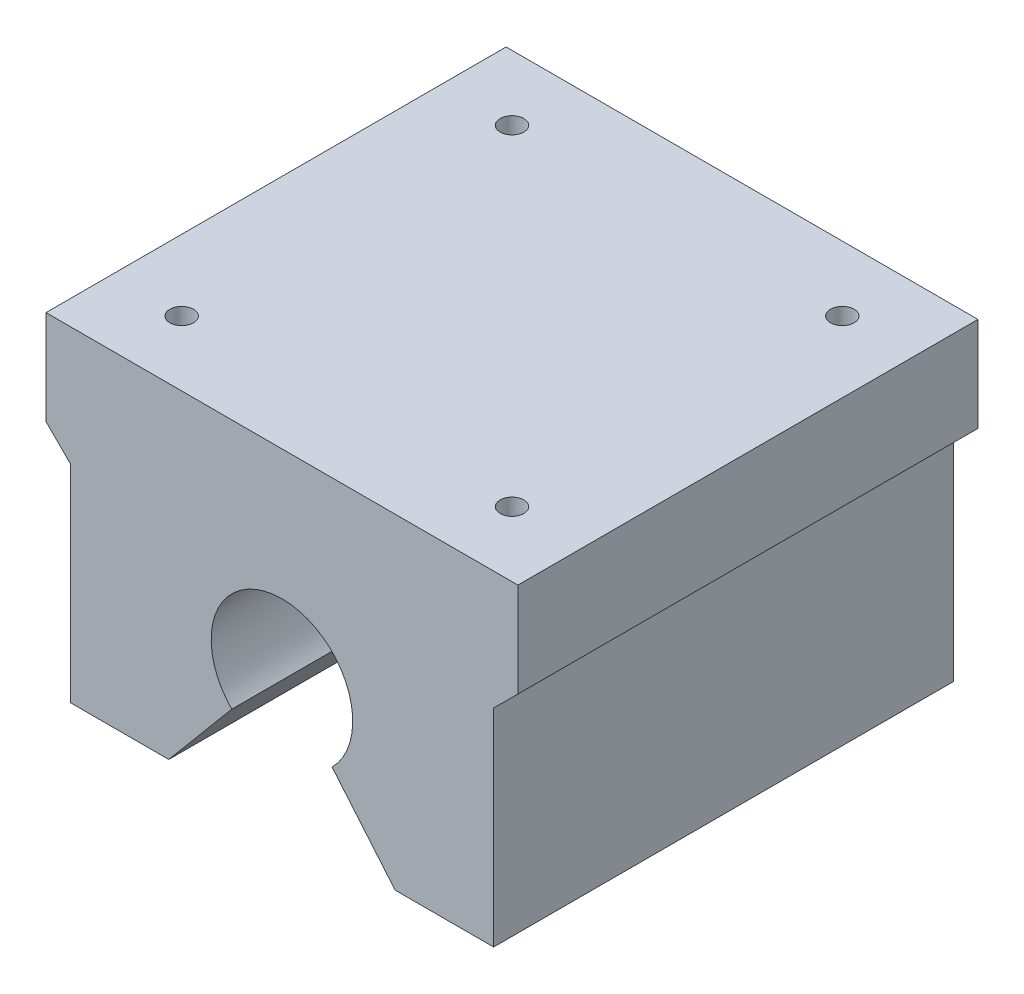
ISO-10303-21;
HEADER;
FILE_DESCRIPTION(('STEP AP214'),'2;1');
FILE_NAME('part.step','',(''),(''),'','','');
FILE_SCHEMA(('AUTOMOTIVE_DESIGN { 1 0 10303 214 1 1 1 1 }'));
ENDSEC;
DATA;
#1=APPLICATION_CONTEXT('core data for automotive mechanical design processes');
#2=APPLICATION_PROTOCOL_DEFINITION('international standard','automotive_design',2000,#1);
#3=PRODUCT_CONTEXT('',#1,'mechanical');
#4=PRODUCT('Part','Part','',(#3));
#5=PRODUCT_RELATED_PRODUCT_CATEGORY('part','',(#4));
#6=PRODUCT_DEFINITION_FORMATION('','',#4);
#7=PRODUCT_DEFINITION_CONTEXT('part definition',#1,'design');
#8=PRODUCT_DEFINITION('design','',#6,#7);
#9=PRODUCT_DEFINITION_SHAPE('','',#8);
#10=(LENGTH_UNIT() NAMED_UNIT(*) SI_UNIT(.MILLI.,.METRE.));
#11=(NAMED_UNIT(*) PLANE_ANGLE_UNIT() SI_UNIT($,.RADIAN.));
#12=(NAMED_UNIT(*) SI_UNIT($,.STERADIAN.) SOLID_ANGLE_UNIT());
#13=UNCERTAINTY_MEASURE_WITH_UNIT(LENGTH_MEASURE(1.E-05),#10,'distance_accuracy_value','');
#14=(GEOMETRIC_REPRESENTATION_CONTEXT(3) GLOBAL_UNCERTAINTY_ASSIGNED_CONTEXT((#13)) GLOBAL_UNIT_ASSIGNED_CONTEXT((#10,
#11,#12)) REPRESENTATION_CONTEXT('',''));
#15=CARTESIAN_POINT('',(0.,0.,0.));
#16=DIRECTION('',(0.,0.,1.));
#17=DIRECTION('',(1.,0.,0.));
#18=AXIS2_PLACEMENT_3D('',#15,#16,#17);
#19=CARTESIAN_POINT('',(0.,0.,39.));
#20=DIRECTION('',(0.,0.,-1.));
#21=DIRECTION('',(-1.,0.,0.));
#22=AXIS2_PLACEMENT_3D('',#19,#20,#21);
#23=CYLINDRICAL_SURFACE('',#22,6.00000000000001);
#24=CARTESIAN_POINT('',(0.,0.,0.));
#25=DIRECTION('',(0.,0.,-1.));
#26=DIRECTION('',(-1.,0.,0.));
#27=AXIS2_PLACEMENT_3D('',#24,#25,#26);
#28=CIRCLE('',#27,6.00000000000001);
#29=CARTESIAN_POINT('',(-4.25,-4.23526858652437,0.));
#30=VERTEX_POINT('',#29);
#31=CARTESIAN_POINT('',(4.25,-4.23526858652437,0.));
#32=VERTEX_POINT('',#31);
#33=EDGE_CURVE('E153',#30,#32,#28,.T.);
#34=ORIENTED_EDGE('',*,*,#33,.T.);
#35=DIRECTION('',(0.,0.,-1.));
#36=VECTOR('',#35,1.);
#37=CARTESIAN_POINT('',(4.25,-4.23526858652437,39.));
#38=LINE('',#37,#36);
#39=CARTESIAN_POINT('',(4.25,-4.23526858652437,39.));
#40=VERTEX_POINT('',#39);
#41=EDGE_CURVE('E11',#40,#32,#38,.T.);
#42=ORIENTED_EDGE('',*,*,#41,.F.);
#43=CARTESIAN_POINT('',(0.,0.,39.));
#44=DIRECTION('',(0.,0.,-1.));
#45=DIRECTION('',(-1.,0.,0.));
#46=AXIS2_PLACEMENT_3D('',#43,#44,#45);
#47=CIRCLE('',#46,6.00000000000001);
#48=CARTESIAN_POINT('',(-4.25,-4.23526858652437,39.));
#49=VERTEX_POINT('',#48);
#50=EDGE_CURVE('E176',#49,#40,#47,.T.);
#51=ORIENTED_EDGE('',*,*,#50,.F.);
#52=DIRECTION('',(0.,0.,-1.));
#53=VECTOR('',#52,1.);
#54=CARTESIAN_POINT('',(-4.25,-4.23526858652437,39.));
#55=LINE('',#54,#53);
#56=EDGE_CURVE('E149',#49,#30,#55,.T.);
#57=ORIENTED_EDGE('',*,*,#56,.T.);
#58=EDGE_LOOP('',(#34,#42,#51,#57));
#59=FACE_BOUND('',#58,.T.);
#60=ADVANCED_FACE('F33',(#59),#23,.F.);
#61=CARTESIAN_POINT('',(9.59064378158988,-10.6,39.));
#62=DIRECTION('',(0.766044443118976,0.642787609686541,0.));
#63=DIRECTION('',(-0.642787609686541,0.766044443118976,0.));
#64=AXIS2_PLACEMENT_3D('',#61,#62,#63);
#65=PLANE('',#64);
#66=DIRECTION('',(0.642787609686541,-0.766044443118976,0.));
#67=VECTOR('',#66,1.);
#68=CARTESIAN_POINT('',(9.59064378158988,-10.6,0.));
#69=LINE('',#68,#67);
#70=CARTESIAN_POINT('',(9.59064378158988,-10.6,0.));
#71=VERTEX_POINT('',#70);
#72=EDGE_CURVE('E156',#32,#71,#69,.T.);
#73=ORIENTED_EDGE('',*,*,#72,.T.);
#74=DIRECTION('',(0.,0.,-1.));
#75=VECTOR('',#74,1.);
#76=CARTESIAN_POINT('',(9.59064378158988,-10.6,39.));
#77=LINE('',#76,#75);
#78=CARTESIAN_POINT('',(9.59064378158988,-10.6,39.));
#79=VERTEX_POINT('',#78);
#80=EDGE_CURVE('E41',#79,#71,#77,.T.);
#81=ORIENTED_EDGE('',*,*,#80,.F.);
#82=DIRECTION('',(0.642787609686541,-0.766044443118976,0.));
#83=VECTOR('',#82,1.);
#84=CARTESIAN_POINT('',(9.59064378158988,-10.6,39.));
#85=LINE('',#84,#83);
#86=EDGE_CURVE('E104',#40,#79,#85,.T.);
#87=ORIENTED_EDGE('',*,*,#86,.F.);
#88=ORIENTED_EDGE('',*,*,#41,.T.);
#89=EDGE_LOOP('',(#73,#81,#87,#88));
#90=FACE_BOUND('',#89,.T.);
#91=ADVANCED_FACE('F254',(#90),#65,.F.);
#92=CARTESIAN_POINT('',(17.9434558555743,-10.6,39.));
#93=DIRECTION('',(0.,1.,0.));
#94=DIRECTION('',(0.,0.,1.));
#95=AXIS2_PLACEMENT_3D('',#92,#93,#94);
#96=PLANE('',#95);
#97=DIRECTION('',(1.,0.,0.));
#98=VECTOR('',#97,1.);
#99=CARTESIAN_POINT('',(17.9434558555743,-10.6,0.));
#100=LINE('',#99,#98);
#101=CARTESIAN_POINT('',(17.9434558555743,-10.6,0.));
#102=VERTEX_POINT('',#101);
#103=EDGE_CURVE('E159',#71,#102,#100,.T.);
#104=ORIENTED_EDGE('',*,*,#103,.T.);
#105=DIRECTION('',(0.,0.,-1.));
#106=VECTOR('',#105,1.);
#107=CARTESIAN_POINT('',(17.9434558555743,-10.6,39.));
#108=LINE('',#107,#106);
#109=CARTESIAN_POINT('',(17.9434558555743,-10.6,39.));
#110=VERTEX_POINT('',#109);
#111=EDGE_CURVE('E195',#110,#102,#108,.T.);
#112=ORIENTED_EDGE('',*,*,#111,.F.);
#113=DIRECTION('',(1.,0.,0.));
#114=VECTOR('',#113,1.);
#115=CARTESIAN_POINT('',(17.9434558555743,-10.6,39.));
#116=LINE('',#115,#114);
#117=EDGE_CURVE('E203',#79,#110,#116,.T.);
#118=ORIENTED_EDGE('',*,*,#117,.F.);
#119=ORIENTED_EDGE('',*,*,#80,.T.);
#120=EDGE_LOOP('',(#104,#112,#118,#119));
#121=FACE_BOUND('',#120,.T.);
#122=ADVANCED_FACE('F201',(#121),#96,.F.);
#123=CARTESIAN_POINT('',(17.9434558555743,6.94345585557433,39.));
#124=DIRECTION('',(-1.,0.,0.));
#125=DIRECTION('',(0.,-1.,0.));
#126=AXIS2_PLACEMENT_3D('',#123,#124,#125);
#127=PLANE('',#126);
#128=DIRECTION('',(0.,1.,0.));
#129=VECTOR('',#128,1.);
#130=CARTESIAN_POINT('',(17.9434558555743,6.94345585557433,0.));
#131=LINE('',#130,#129);
#132=CARTESIAN_POINT('',(17.9434558555743,6.94345585557433,0.));
#133=VERTEX_POINT('',#132);
#134=EDGE_CURVE('E161',#102,#133,#131,.T.);
#135=ORIENTED_EDGE('',*,*,#134,.T.);
#136=DIRECTION('',(0.,0.,-1.));
#137=VECTOR('',#136,1.);
#138=CARTESIAN_POINT('',(17.9434558555743,6.94345585557433,39.));
#139=LINE('',#138,#137);
#140=CARTESIAN_POINT('',(17.9434558555743,6.94345585557433,39.));
#141=VERTEX_POINT('',#140);
#142=EDGE_CURVE('E192',#141,#133,#139,.T.);
#143=ORIENTED_EDGE('',*,*,#142,.F.);
#144=DIRECTION('',(0.,1.,0.));
#145=VECTOR('',#144,1.);
#146=CARTESIAN_POINT('',(17.9434558555743,6.94345585557433,39.));
#147=LINE('',#146,#145);
#148=EDGE_CURVE('E221',#110,#141,#147,.T.);
#149=ORIENTED_EDGE('',*,*,#148,.F.);
#150=ORIENTED_EDGE('',*,*,#111,.T.);
#151=EDGE_LOOP('',(#135,#143,#149,#150));
#152=FACE_BOUND('',#151,.T.);
#153=ADVANCED_FACE('F212',(#152),#127,.F.);
#154=CARTESIAN_POINT('',(20.,9.,39.));
#155=DIRECTION('',(-0.707106781186547,0.707106781186548,0.));
#156=DIRECTION('',(-0.707106781186548,-0.707106781186547,0.));
#157=AXIS2_PLACEMENT_3D('',#154,#155,#156);
#158=PLANE('',#157);
#159=DIRECTION('',(0.707106781186548,0.707106781186547,0.));
#160=VECTOR('',#159,1.);
#161=CARTESIAN_POINT('',(20.,9.,0.));
#162=LINE('',#161,#160);
#163=CARTESIAN_POINT('',(20.,9.,0.));
#164=VERTEX_POINT('',#163);
#165=EDGE_CURVE('E163',#133,#164,#162,.T.);
#166=ORIENTED_EDGE('',*,*,#165,.T.);
#167=DIRECTION('',(0.,0.,-1.));
#168=VECTOR('',#167,1.);
#169=CARTESIAN_POINT('',(20.,9.,39.));
#170=LINE('',#169,#168);
#171=CARTESIAN_POINT('',(20.,9.,39.));
#172=VERTEX_POINT('',#171);
#173=EDGE_CURVE('E189',#172,#164,#170,.T.);
#174=ORIENTED_EDGE('',*,*,#173,.F.);
#175=DIRECTION('',(0.707106781186548,0.707106781186547,0.));
#176=VECTOR('',#175,1.);
#177=CARTESIAN_POINT('',(20.,9.,39.));
#178=LINE('',#177,#176);
#179=EDGE_CURVE('E218',#141,#172,#178,.T.);
#180=ORIENTED_EDGE('',*,*,#179,.F.);
#181=ORIENTED_EDGE('',*,*,#142,.T.);
#182=EDGE_LOOP('',(#166,#174,#180,#181));
#183=FACE_BOUND('',#182,.T.);
#184=ADVANCED_FACE('F216',(#183),#158,.F.);
#185=CARTESIAN_POINT('',(20.,17.,39.));
#186=DIRECTION('',(-1.,0.,0.));
#187=DIRECTION('',(0.,-1.,0.));
#188=AXIS2_PLACEMENT_3D('',#185,#186,#187);
#189=PLANE('',#188);
#190=DIRECTION('',(0.,1.,0.));
#191=VECTOR('',#190,1.);
#192=CARTESIAN_POINT('',(20.,17.,0.));
#193=LINE('',#192,#191);
#194=CARTESIAN_POINT('',(20.,17.,0.));
#195=VERTEX_POINT('',#194);
#196=EDGE_CURVE('E165',#164,#195,#193,.T.);
#197=ORIENTED_EDGE('',*,*,#196,.T.);
#198=DIRECTION('',(0.,0.,-1.));
#199=VECTOR('',#198,1.);
#200=CARTESIAN_POINT('',(20.,17.,39.));
#201=LINE('',#200,#199);
#202=CARTESIAN_POINT('',(20.,17.,39.));
#203=VERTEX_POINT('',#202);
#204=EDGE_CURVE('E186',#203,#195,#201,.T.);
#205=ORIENTED_EDGE('',*,*,#204,.F.);
#206=DIRECTION('',(0.,1.,0.));
#207=VECTOR('',#206,1.);
#208=CARTESIAN_POINT('',(20.,17.,39.));
#209=LINE('',#208,#207);
#210=EDGE_CURVE('E220',#172,#203,#209,.T.);
#211=ORIENTED_EDGE('',*,*,#210,.F.);
#212=ORIENTED_EDGE('',*,*,#173,.T.);
#213=EDGE_LOOP('',(#197,#205,#211,#212));
#214=FACE_BOUND('',#213,.T.);
#215=ADVANCED_FACE('F267',(#214),#189,.F.);
#216=CARTESIAN_POINT('',(20.,17.,39.));
#217=DIRECTION('',(0.,-1.,0.));
#218=DIRECTION('',(0.,0.,-1.));
#219=AXIS2_PLACEMENT_3D('',#216,#217,#218);
#220=PLANE('',#219);
#221=CARTESIAN_POINT('',(14.,17.,5.5));
#222=DIRECTION('',(0.,1.,0.));
#223=DIRECTION('',(0.,0.,1.));
#224=AXIS2_PLACEMENT_3D('',#221,#222,#223);
#225=CIRCLE('',#224,1.);
#226=CARTESIAN_POINT('',(14.,17.,6.5));
#227=VERTEX_POINT('',#226);
#228=EDGE_CURVE('E397',#227,#227,#225,.T.);
#229=ORIENTED_EDGE('',*,*,#228,.F.);
#230=EDGE_LOOP('',(#229));
#231=FACE_BOUND('',#230,.T.);
#232=CARTESIAN_POINT('',(-14.,17.,5.5));
#233=DIRECTION('',(0.,1.,0.));
#234=DIRECTION('',(0.,0.,1.));
#235=AXIS2_PLACEMENT_3D('',#232,#233,#234);
#236=CIRCLE('',#235,1.);
#237=CARTESIAN_POINT('',(-14.,17.,6.5));
#238=VERTEX_POINT('',#237);
#239=EDGE_CURVE('E396',#238,#238,#236,.T.);
#240=ORIENTED_EDGE('',*,*,#239,.F.);
#241=EDGE_LOOP('',(#240));
#242=FACE_BOUND('',#241,.T.);
#243=CARTESIAN_POINT('',(14.,17.,33.5));
#244=DIRECTION('',(0.,1.,0.));
#245=DIRECTION('',(0.,0.,1.));
#246=AXIS2_PLACEMENT_3D('',#243,#244,#245);
#247=CIRCLE('',#246,1.);
#248=CARTESIAN_POINT('',(14.,17.,34.5));
#249=VERTEX_POINT('',#248);
#250=EDGE_CURVE('E406',#249,#249,#247,.T.);
#251=ORIENTED_EDGE('',*,*,#250,.F.);
#252=EDGE_LOOP('',(#251));
#253=FACE_BOUND('',#252,.T.);
#254=CARTESIAN_POINT('',(-14.,17.,33.5));
#255=DIRECTION('',(0.,1.,0.));
#256=DIRECTION('',(0.,0.,1.));
#257=AXIS2_PLACEMENT_3D('',#254,#255,#256);
#258=CIRCLE('',#257,1.);
#259=CARTESIAN_POINT('',(-14.,17.,34.5));
#260=VERTEX_POINT('',#259);
#261=EDGE_CURVE('E411',#260,#260,#258,.T.);
#262=ORIENTED_EDGE('',*,*,#261,.F.);
#263=EDGE_LOOP('',(#262));
#264=FACE_BOUND('',#263,.T.);
#265=DIRECTION('',(-1.,0.,0.));
#266=VECTOR('',#265,1.);
#267=CARTESIAN_POINT('',(20.,17.,0.));
#268=LINE('',#267,#266);
#269=CARTESIAN_POINT('',(-20.,17.,0.));
#270=VERTEX_POINT('',#269);
#271=EDGE_CURVE('E167',#195,#270,#268,.T.);
#272=ORIENTED_EDGE('',*,*,#271,.T.);
#273=DIRECTION('',(0.,0.,-1.));
#274=VECTOR('',#273,1.);
#275=CARTESIAN_POINT('',(-20.,17.,39.));
#276=LINE('',#275,#274);
#277=CARTESIAN_POINT('',(-20.,17.,39.));
#278=VERTEX_POINT('',#277);
#279=EDGE_CURVE('E183',#278,#270,#276,.T.);
#280=ORIENTED_EDGE('',*,*,#279,.F.);
#281=DIRECTION('',(-1.,0.,0.));
#282=VECTOR('',#281,1.);
#283=CARTESIAN_POINT('',(20.,17.,39.));
#284=LINE('',#283,#282);
#285=EDGE_CURVE('E223',#203,#278,#284,.T.);
#286=ORIENTED_EDGE('',*,*,#285,.F.);
#287=ORIENTED_EDGE('',*,*,#204,.T.);
#288=EDGE_LOOP('',(#272,#280,#286,#287));
#289=FACE_BOUND('',#288,.T.);
#290=ADVANCED_FACE('F270',(#231,#242,#253,#264,#289),#220,.F.);
#291=CARTESIAN_POINT('',(-20.,17.,39.));
#292=DIRECTION('',(1.,0.,0.));
#293=DIRECTION('',(0.,1.,0.));
#294=AXIS2_PLACEMENT_3D('',#291,#292,#293);
#295=PLANE('',#294);
#296=DIRECTION('',(0.,-1.,0.));
#297=VECTOR('',#296,1.);
#298=CARTESIAN_POINT('',(-20.,17.,0.));
#299=LINE('',#298,#297);
#300=CARTESIAN_POINT('',(-20.,9.,0.));
#301=VERTEX_POINT('',#300);
#302=EDGE_CURVE('E169',#270,#301,#299,.T.);
#303=ORIENTED_EDGE('',*,*,#302,.T.);
#304=DIRECTION('',(0.,0.,-1.));
#305=VECTOR('',#304,1.);
#306=CARTESIAN_POINT('',(-20.,9.,39.));
#307=LINE('',#306,#305);
#308=CARTESIAN_POINT('',(-20.,9.,39.));
#309=VERTEX_POINT('',#308);
#310=EDGE_CURVE('E180',#309,#301,#307,.T.);
#311=ORIENTED_EDGE('',*,*,#310,.F.);
#312=DIRECTION('',(0.,-1.,0.));
#313=VECTOR('',#312,1.);
#314=CARTESIAN_POINT('',(-20.,17.,39.));
#315=LINE('',#314,#313);
#316=EDGE_CURVE('E229',#278,#309,#315,.T.);
#317=ORIENTED_EDGE('',*,*,#316,.F.);
#318=ORIENTED_EDGE('',*,*,#279,.T.);
#319=EDGE_LOOP('',(#303,#311,#317,#318));
#320=FACE_BOUND('',#319,.T.);
#321=ADVANCED_FACE('F235',(#320),#295,.F.);
#322=CARTESIAN_POINT('',(-20.,9.,39.));
#323=DIRECTION('',(0.707106781186547,0.707106781186548,0.));
#324=DIRECTION('',(-0.707106781186548,0.707106781186547,0.));
#325=AXIS2_PLACEMENT_3D('',#322,#323,#324);
#326=PLANE('',#325);
#327=DIRECTION('',(0.707106781186548,-0.707106781186547,0.));
#328=VECTOR('',#327,1.);
#329=CARTESIAN_POINT('',(-20.,9.,0.));
#330=LINE('',#329,#328);
#331=CARTESIAN_POINT('',(-17.9434558555743,6.94345585557433,0.));
#332=VERTEX_POINT('',#331);
#333=EDGE_CURVE('E171',#301,#332,#330,.T.);
#334=ORIENTED_EDGE('',*,*,#333,.T.);
#335=DIRECTION('',(0.,0.,-1.));
#336=VECTOR('',#335,1.);
#337=CARTESIAN_POINT('',(-17.9434558555743,6.94345585557433,39.));
#338=LINE('',#337,#336);
#339=CARTESIAN_POINT('',(-17.9434558555743,6.94345585557433,39.));
#340=VERTEX_POINT('',#339);
#341=EDGE_CURVE('E144',#340,#332,#338,.T.);
#342=ORIENTED_EDGE('',*,*,#341,.F.);
#343=DIRECTION('',(0.707106781186548,-0.707106781186547,0.));
#344=VECTOR('',#343,1.);
#345=CARTESIAN_POINT('',(-20.,9.,39.));
#346=LINE('',#345,#344);
#347=EDGE_CURVE('E135',#309,#340,#346,.T.);
#348=ORIENTED_EDGE('',*,*,#347,.F.);
#349=ORIENTED_EDGE('',*,*,#310,.T.);
#350=EDGE_LOOP('',(#334,#342,#348,#349));
#351=FACE_BOUND('',#350,.T.);
#352=ADVANCED_FACE('F239',(#351),#326,.F.);
#353=CARTESIAN_POINT('',(-17.9434558555743,6.94345585557433,39.));
#354=DIRECTION('',(1.,0.,0.));
#355=DIRECTION('',(0.,1.,0.));
#356=AXIS2_PLACEMENT_3D('',#353,#354,#355);
#357=PLANE('',#356);
#358=DIRECTION('',(0.,-1.,0.));
#359=VECTOR('',#358,1.);
#360=CARTESIAN_POINT('',(-17.9434558555743,6.94345585557433,0.));
#361=LINE('',#360,#359);
#362=CARTESIAN_POINT('',(-17.9434558555743,-10.6,0.));
#363=VERTEX_POINT('',#362);
#364=EDGE_CURVE('E143',#332,#363,#361,.T.);
#365=ORIENTED_EDGE('',*,*,#364,.T.);
#366=DIRECTION('',(0.,0.,-1.));
#367=VECTOR('',#366,1.);
#368=CARTESIAN_POINT('',(-17.9434558555743,-10.6,39.));
#369=LINE('',#368,#367);
#370=CARTESIAN_POINT('',(-17.9434558555743,-10.6,39.));
#371=VERTEX_POINT('',#370);
#372=EDGE_CURVE('E140',#371,#363,#369,.T.);
#373=ORIENTED_EDGE('',*,*,#372,.F.);
#374=DIRECTION('',(0.,-1.,0.));
#375=VECTOR('',#374,1.);
#376=CARTESIAN_POINT('',(-17.9434558555743,6.94345585557433,39.));
#377=LINE('',#376,#375);
#378=EDGE_CURVE('E129',#340,#371,#377,.T.);
#379=ORIENTED_EDGE('',*,*,#378,.F.);
#380=ORIENTED_EDGE('',*,*,#341,.T.);
#381=EDGE_LOOP('',(#365,#373,#379,#380));
#382=FACE_BOUND('',#381,.T.);
#383=ADVANCED_FACE('F141',(#382),#357,.F.);
#384=CARTESIAN_POINT('',(-17.9434558555743,-10.6,39.));
#385=DIRECTION('',(0.,1.,0.));
#386=DIRECTION('',(0.,0.,1.));
#387=AXIS2_PLACEMENT_3D('',#384,#385,#386);
#388=PLANE('',#387);
#389=DIRECTION('',(1.,0.,0.));
#390=VECTOR('',#389,1.);
#391=CARTESIAN_POINT('',(-17.9434558555743,-10.6,0.));
#392=LINE('',#391,#390);
#393=CARTESIAN_POINT('',(-9.59064378158988,-10.6,0.));
#394=VERTEX_POINT('',#393);
#395=EDGE_CURVE('E90',#363,#394,#392,.T.);
#396=ORIENTED_EDGE('',*,*,#395,.T.);
#397=DIRECTION('',(0.,0.,-1.));
#398=VECTOR('',#397,1.);
#399=CARTESIAN_POINT('',(-9.59064378158988,-10.6,39.));
#400=LINE('',#399,#398);
#401=CARTESIAN_POINT('',(-9.59064378158988,-10.6,39.));
#402=VERTEX_POINT('',#401);
#403=EDGE_CURVE('E145',#402,#394,#400,.T.);
#404=ORIENTED_EDGE('',*,*,#403,.F.);
#405=DIRECTION('',(1.,0.,0.));
#406=VECTOR('',#405,1.);
#407=CARTESIAN_POINT('',(-17.9434558555743,-10.6,39.));
#408=LINE('',#407,#406);
#409=EDGE_CURVE('E133',#371,#402,#408,.T.);
#410=ORIENTED_EDGE('',*,*,#409,.F.);
#411=ORIENTED_EDGE('',*,*,#372,.T.);
#412=EDGE_LOOP('',(#396,#404,#410,#411));
#413=FACE_BOUND('',#412,.T.);
#414=ADVANCED_FACE('F147',(#413),#388,.F.);
#415=CARTESIAN_POINT('',(-9.59064378158988,-10.6,39.));
#416=DIRECTION('',(-0.766044443118976,0.642787609686541,0.));
#417=DIRECTION('',(-0.642787609686541,-0.766044443118976,0.));
#418=AXIS2_PLACEMENT_3D('',#415,#416,#417);
#419=PLANE('',#418);
#420=DIRECTION('',(0.642787609686541,0.766044443118976,0.));
#421=VECTOR('',#420,1.);
#422=CARTESIAN_POINT('',(-9.59064378158988,-10.6,0.));
#423=LINE('',#422,#421);
#424=EDGE_CURVE('E96',#394,#30,#423,.T.);
#425=ORIENTED_EDGE('',*,*,#424,.T.);
#426=ORIENTED_EDGE('',*,*,#56,.F.);
#427=DIRECTION('',(0.642787609686541,0.766044443118976,0.));
#428=VECTOR('',#427,1.);
#429=CARTESIAN_POINT('',(-9.59064378158988,-10.6,39.));
#430=LINE('',#429,#428);
#431=EDGE_CURVE('E49',#402,#49,#430,.T.);
#432=ORIENTED_EDGE('',*,*,#431,.F.);
#433=ORIENTED_EDGE('',*,*,#403,.T.);
#434=EDGE_LOOP('',(#425,#426,#432,#433));
#435=FACE_BOUND('',#434,.T.);
#436=ADVANCED_FACE('F243',(#435),#419,.F.);
#437=CARTESIAN_POINT('',(0.,0.,39.));
#438=DIRECTION('',(0.,0.,-1.));
#439=DIRECTION('',(-1.,0.,0.));
#440=AXIS2_PLACEMENT_3D('',#437,#438,#439);
#441=PLANE('',#440);
#442=ORIENTED_EDGE('',*,*,#50,.T.);
#443=ORIENTED_EDGE('',*,*,#86,.T.);
#444=ORIENTED_EDGE('',*,*,#117,.T.);
#445=ORIENTED_EDGE('',*,*,#148,.T.);
#446=ORIENTED_EDGE('',*,*,#179,.T.);
#447=ORIENTED_EDGE('',*,*,#210,.T.);
#448=ORIENTED_EDGE('',*,*,#285,.T.);
#449=ORIENTED_EDGE('',*,*,#316,.T.);
#450=ORIENTED_EDGE('',*,*,#347,.T.);
#451=ORIENTED_EDGE('',*,*,#378,.T.);
#452=ORIENTED_EDGE('',*,*,#409,.T.);
#453=ORIENTED_EDGE('',*,*,#431,.T.);
#454=EDGE_LOOP('',(#442,#443,#444,#445,#446,#447,#448,#449,#450,#451,#452,#453));
#455=FACE_BOUND('',#454,.T.);
#456=ADVANCED_FACE('F131',(#455),#441,.F.);
#457=CARTESIAN_POINT('',(0.,0.,0.));
#458=DIRECTION('',(0.,0.,-1.));
#459=DIRECTION('',(-1.,0.,0.));
#460=AXIS2_PLACEMENT_3D('',#457,#458,#459);
#461=PLANE('',#460);
#462=ORIENTED_EDGE('',*,*,#33,.F.);
#463=ORIENTED_EDGE('',*,*,#424,.F.);
#464=ORIENTED_EDGE('',*,*,#395,.F.);
#465=ORIENTED_EDGE('',*,*,#364,.F.);
#466=ORIENTED_EDGE('',*,*,#333,.F.);
#467=ORIENTED_EDGE('',*,*,#302,.F.);
#468=ORIENTED_EDGE('',*,*,#271,.F.);
#469=ORIENTED_EDGE('',*,*,#196,.F.);
#470=ORIENTED_EDGE('',*,*,#165,.F.);
#471=ORIENTED_EDGE('',*,*,#134,.F.);
#472=ORIENTED_EDGE('',*,*,#103,.F.);
#473=ORIENTED_EDGE('',*,*,#72,.F.);
#474=EDGE_LOOP('',(#462,#463,#464,#465,#466,#467,#468,#469,#470,#471,#472,#473));
#475=FACE_BOUND('',#474,.T.);
#476=ADVANCED_FACE('F207',(#475),#461,.T.);
#477=CARTESIAN_POINT('',(-14.,7.,33.5));
#478=DIRECTION('',(0.,1.,0.));
#479=DIRECTION('',(0.,0.,1.));
#480=AXIS2_PLACEMENT_3D('',#477,#478,#479);
#481=CYLINDRICAL_SURFACE('',#480,1.);
#482=CARTESIAN_POINT('',(-14.,7.,33.5));
#483=DIRECTION('',(0.,1.,0.));
#484=DIRECTION('',(0.,0.,1.));
#485=AXIS2_PLACEMENT_3D('',#482,#483,#484);
#486=CIRCLE('',#485,1.);
#487=CARTESIAN_POINT('',(-14.,7.,34.5));
#488=VERTEX_POINT('',#487);
#489=EDGE_CURVE('E157',#488,#488,#486,.T.);
#490=ORIENTED_EDGE('',*,*,#489,.F.);
#491=EDGE_LOOP('',(#490));
#492=FACE_BOUND('',#491,.T.);
#493=ORIENTED_EDGE('',*,*,#261,.T.);
#494=EDGE_LOOP('',(#493));
#495=FACE_BOUND('',#494,.T.);
#496=ADVANCED_FACE('F306',(#492,#495),#481,.F.);
#497=CARTESIAN_POINT('',(-14.,7.,33.5));
#498=DIRECTION('',(0.,1.,0.));
#499=DIRECTION('',(0.,0.,1.));
#500=AXIS2_PLACEMENT_3D('',#497,#498,#499);
#501=PLANE('',#500);
#502=ORIENTED_EDGE('',*,*,#489,.T.);
#503=EDGE_LOOP('',(#502));
#504=FACE_BOUND('',#503,.T.);
#505=ADVANCED_FACE('F319',(#504),#501,.T.);
#506=CARTESIAN_POINT('',(14.,7.,33.5));
#507=DIRECTION('',(0.,1.,0.));
#508=DIRECTION('',(0.,0.,1.));
#509=AXIS2_PLACEMENT_3D('',#506,#507,#508);
#510=CYLINDRICAL_SURFACE('',#509,1.);
#511=CARTESIAN_POINT('',(14.,7.,33.5));
#512=DIRECTION('',(0.,1.,0.));
#513=DIRECTION('',(0.,0.,1.));
#514=AXIS2_PLACEMENT_3D('',#511,#512,#513);
#515=CIRCLE('',#514,1.);
#516=CARTESIAN_POINT('',(14.,7.,34.5));
#517=VERTEX_POINT('',#516);
#518=EDGE_CURVE('E408',#517,#517,#515,.T.);
#519=ORIENTED_EDGE('',*,*,#518,.F.);
#520=EDGE_LOOP('',(#519));
#521=FACE_BOUND('',#520,.T.);
#522=ORIENTED_EDGE('',*,*,#250,.T.);
#523=EDGE_LOOP('',(#522));
#524=FACE_BOUND('',#523,.T.);
#525=ADVANCED_FACE('F329',(#521,#524),#510,.F.);
#526=CARTESIAN_POINT('',(14.,7.,33.5));
#527=DIRECTION('',(0.,1.,0.));
#528=DIRECTION('',(0.,0.,1.));
#529=AXIS2_PLACEMENT_3D('',#526,#527,#528);
#530=PLANE('',#529);
#531=ORIENTED_EDGE('',*,*,#518,.T.);
#532=EDGE_LOOP('',(#531));
#533=FACE_BOUND('',#532,.T.);
#534=ADVANCED_FACE('F339',(#533),#530,.T.);
#535=CARTESIAN_POINT('',(-14.,7.,5.5));
#536=DIRECTION('',(0.,1.,0.));
#537=DIRECTION('',(0.,0.,1.));
#538=AXIS2_PLACEMENT_3D('',#535,#536,#537);
#539=CYLINDRICAL_SURFACE('',#538,1.);
#540=CARTESIAN_POINT('',(-14.,7.,5.5));
#541=DIRECTION('',(0.,1.,0.));
#542=DIRECTION('',(0.,0.,1.));
#543=AXIS2_PLACEMENT_3D('',#540,#541,#542);
#544=CIRCLE('',#543,1.);
#545=CARTESIAN_POINT('',(-14.,7.,6.5));
#546=VERTEX_POINT('',#545);
#547=EDGE_CURVE('E400',#546,#546,#544,.T.);
#548=ORIENTED_EDGE('',*,*,#547,.F.);
#549=EDGE_LOOP('',(#548));
#550=FACE_BOUND('',#549,.T.);
#551=ORIENTED_EDGE('',*,*,#239,.T.);
#552=EDGE_LOOP('',(#551));
#553=FACE_BOUND('',#552,.T.);
#554=ADVANCED_FACE('F349',(#550,#553),#539,.F.);
#555=CARTESIAN_POINT('',(-14.,7.,5.5));
#556=DIRECTION('',(0.,1.,0.));
#557=DIRECTION('',(0.,0.,1.));
#558=AXIS2_PLACEMENT_3D('',#555,#556,#557);
#559=PLANE('',#558);
#560=ORIENTED_EDGE('',*,*,#547,.T.);
#561=EDGE_LOOP('',(#560));
#562=FACE_BOUND('',#561,.T.);
#563=ADVANCED_FACE('F359',(#562),#559,.T.);
#564=CARTESIAN_POINT('',(14.,7.,5.5));
#565=DIRECTION('',(0.,1.,0.));
#566=DIRECTION('',(0.,0.,1.));
#567=AXIS2_PLACEMENT_3D('',#564,#565,#566);
#568=CYLINDRICAL_SURFACE('',#567,1.);
#569=CARTESIAN_POINT('',(14.,7.,5.5));
#570=DIRECTION('',(0.,1.,0.));
#571=DIRECTION('',(0.,0.,1.));
#572=AXIS2_PLACEMENT_3D('',#569,#570,#571);
#573=CIRCLE('',#572,1.);
#574=CARTESIAN_POINT('',(14.,7.,6.5));
#575=VERTEX_POINT('',#574);
#576=EDGE_CURVE('E395',#575,#575,#573,.T.);
#577=ORIENTED_EDGE('',*,*,#576,.F.);
#578=EDGE_LOOP('',(#577));
#579=FACE_BOUND('',#578,.T.);
#580=ORIENTED_EDGE('',*,*,#228,.T.);
#581=EDGE_LOOP('',(#580));
#582=FACE_BOUND('',#581,.T.);
#583=ADVANCED_FACE('F369',(#579,#582),#568,.F.);
#584=CARTESIAN_POINT('',(14.,7.,5.5));
#585=DIRECTION('',(0.,1.,0.));
#586=DIRECTION('',(0.,0.,1.));
#587=AXIS2_PLACEMENT_3D('',#584,#585,#586);
#588=PLANE('',#587);
#589=ORIENTED_EDGE('',*,*,#576,.T.);
#590=EDGE_LOOP('',(#589));
#591=FACE_BOUND('',#590,.T.);
#592=ADVANCED_FACE('F379',(#591),#588,.T.);
#593=CLOSED_SHELL('',(#60,#91,#122,#153,#184,#215,#290,#321,#352,#383,#414,#436,#456,#476,#496,
#505,#525,#534,#554,#563,#583,#592));
#594=MANIFOLD_SOLID_BREP('B2',#593);
#595=ADVANCED_BREP_SHAPE_REPRESENTATION('',(#18,#594),#14);
#596=SHAPE_DEFINITION_REPRESENTATION(#9,#595);
ENDSEC;
END-ISO-10303-21;
